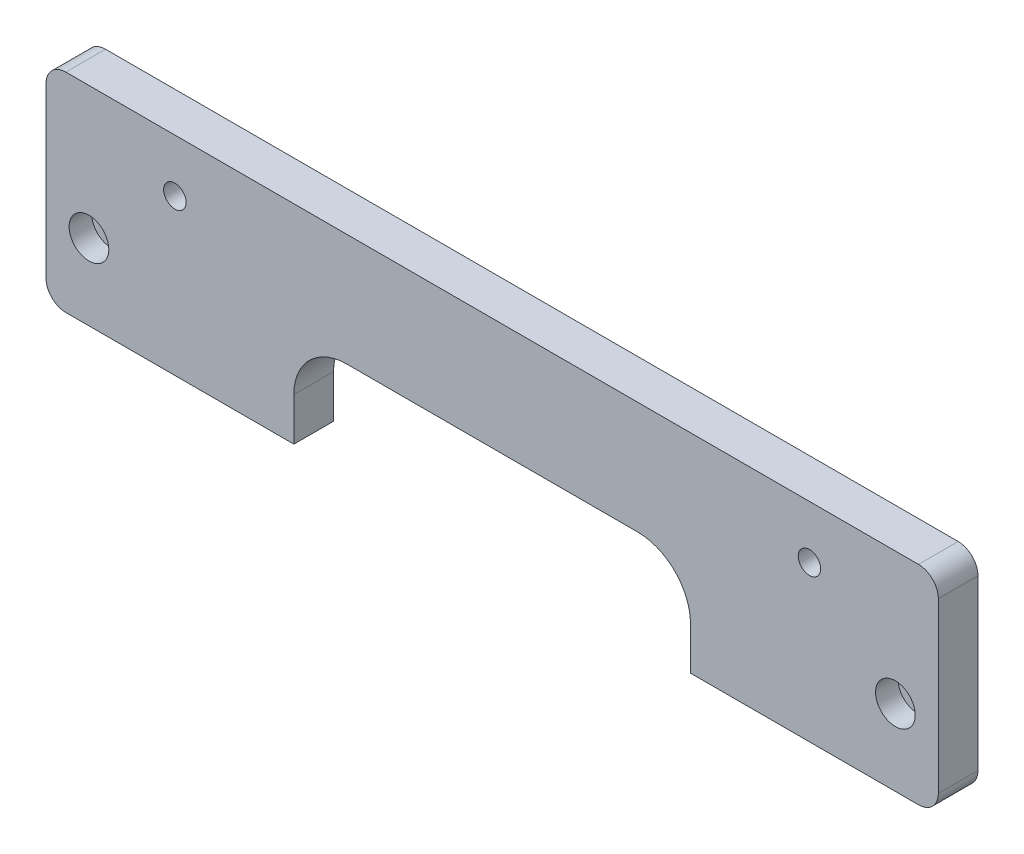
ISO-10303-21;
HEADER;
FILE_DESCRIPTION(('STEP AP214'),'2;1');
FILE_NAME('part.step','',(''),(''),'','','');
FILE_SCHEMA(('AUTOMOTIVE_DESIGN { 1 0 10303 214 1 1 1 1 }'));
ENDSEC;
DATA;
#1=APPLICATION_CONTEXT('core data for automotive mechanical design processes');
#2=APPLICATION_PROTOCOL_DEFINITION('international standard','automotive_design',2000,#1);
#3=PRODUCT_CONTEXT('',#1,'mechanical');
#4=PRODUCT('Part','Part','',(#3));
#5=PRODUCT_RELATED_PRODUCT_CATEGORY('part','',(#4));
#6=PRODUCT_DEFINITION_FORMATION('','',#4);
#7=PRODUCT_DEFINITION_CONTEXT('part definition',#1,'design');
#8=PRODUCT_DEFINITION('design','',#6,#7);
#9=PRODUCT_DEFINITION_SHAPE('','',#8);
#10=(LENGTH_UNIT() NAMED_UNIT(*) SI_UNIT(.MILLI.,.METRE.));
#11=(NAMED_UNIT(*) PLANE_ANGLE_UNIT() SI_UNIT($,.RADIAN.));
#12=(NAMED_UNIT(*) SI_UNIT($,.STERADIAN.) SOLID_ANGLE_UNIT());
#13=UNCERTAINTY_MEASURE_WITH_UNIT(LENGTH_MEASURE(1.E-05),#10,'distance_accuracy_value','');
#14=(GEOMETRIC_REPRESENTATION_CONTEXT(3) GLOBAL_UNCERTAINTY_ASSIGNED_CONTEXT((#13)) GLOBAL_UNIT_ASSIGNED_CONTEXT((#10,
#11,#12)) REPRESENTATION_CONTEXT('',''));
#15=CARTESIAN_POINT('',(0.,0.,0.));
#16=DIRECTION('',(0.,0.,1.));
#17=DIRECTION('',(1.,0.,0.));
#18=AXIS2_PLACEMENT_3D('',#15,#16,#17);
#19=CARTESIAN_POINT('',(0.,0.,6.));
#20=DIRECTION('',(1.,0.,0.));
#21=DIRECTION('',(0.,0.,-1.));
#22=AXIS2_PLACEMENT_3D('',#19,#20,#21);
#23=PLANE('',#22);
#24=DIRECTION('',(0.,-1.,0.));
#25=VECTOR('',#24,1.);
#26=CARTESIAN_POINT('',(0.,0.,0.));
#27=LINE('',#26,#25);
#28=CARTESIAN_POINT('',(0.,28.5,0.));
#29=VERTEX_POINT('',#28);
#30=CARTESIAN_POINT('',(0.,3.,0.));
#31=VERTEX_POINT('',#30);
#32=EDGE_CURVE('E163',#29,#31,#27,.T.);
#33=ORIENTED_EDGE('',*,*,#32,.T.);
#34=DIRECTION('',(0.,0.,-1.));
#35=VECTOR('',#34,1.);
#36=CARTESIAN_POINT('',(0.,3.,6.));
#37=LINE('',#36,#35);
#38=CARTESIAN_POINT('',(0.,3.,6.));
#39=VERTEX_POINT('',#38);
#40=EDGE_CURVE('E11',#31,#39,#37,.F.);
#41=ORIENTED_EDGE('',*,*,#40,.T.);
#42=DIRECTION('',(0.,-1.,0.));
#43=VECTOR('',#42,1.);
#44=CARTESIAN_POINT('',(0.,0.,6.));
#45=LINE('',#44,#43);
#46=CARTESIAN_POINT('',(0.,28.5,6.));
#47=VERTEX_POINT('',#46);
#48=EDGE_CURVE('E130',#47,#39,#45,.T.);
#49=ORIENTED_EDGE('',*,*,#48,.F.);
#50=DIRECTION('',(0.,0.,-1.));
#51=VECTOR('',#50,1.);
#52=CARTESIAN_POINT('',(0.,28.5,6.));
#53=LINE('',#52,#51);
#54=EDGE_CURVE('E25',#47,#29,#53,.T.);
#55=ORIENTED_EDGE('',*,*,#54,.T.);
#56=EDGE_LOOP('',(#33,#41,#49,#55));
#57=FACE_BOUND('',#56,.T.);
#58=ADVANCED_FACE('F17',(#57),#23,.F.);
#59=CARTESIAN_POINT('',(0.,0.,6.));
#60=DIRECTION('',(0.,1.,0.));
#61=DIRECTION('',(0.,0.,1.));
#62=AXIS2_PLACEMENT_3D('',#59,#60,#61);
#63=PLANE('',#62);
#64=DIRECTION('',(1.,0.,0.));
#65=VECTOR('',#64,1.);
#66=CARTESIAN_POINT('',(0.,0.,6.));
#67=LINE('',#66,#65);
#68=CARTESIAN_POINT('',(3.,0.,6.));
#69=VERTEX_POINT('',#68);
#70=CARTESIAN_POINT('',(37.5,0.,6.));
#71=VERTEX_POINT('',#70);
#72=EDGE_CURVE('E117',#69,#71,#67,.T.);
#73=ORIENTED_EDGE('',*,*,#72,.F.);
#74=DIRECTION('',(0.,0.,-1.));
#75=VECTOR('',#74,1.);
#76=CARTESIAN_POINT('',(3.,0.,6.));
#77=LINE('',#76,#75);
#78=CARTESIAN_POINT('',(3.,0.,0.));
#79=VERTEX_POINT('',#78);
#80=EDGE_CURVE('E222',#69,#79,#77,.T.);
#81=ORIENTED_EDGE('',*,*,#80,.T.);
#82=DIRECTION('',(1.,0.,0.));
#83=VECTOR('',#82,1.);
#84=CARTESIAN_POINT('',(0.,0.,0.));
#85=LINE('',#84,#83);
#86=CARTESIAN_POINT('',(37.5,0.,0.));
#87=VERTEX_POINT('',#86);
#88=EDGE_CURVE('E136',#79,#87,#85,.T.);
#89=ORIENTED_EDGE('',*,*,#88,.T.);
#90=DIRECTION('',(0.,0.,-1.));
#91=VECTOR('',#90,1.);
#92=CARTESIAN_POINT('',(37.5,0.,6.));
#93=LINE('',#92,#91);
#94=EDGE_CURVE('E133',#71,#87,#93,.T.);
#95=ORIENTED_EDGE('',*,*,#94,.F.);
#96=EDGE_LOOP('',(#73,#81,#89,#95));
#97=FACE_BOUND('',#96,.T.);
#98=ADVANCED_FACE('F134',(#97),#63,.F.);
#99=CARTESIAN_POINT('',(37.5,0.,6.));
#100=DIRECTION('',(-1.,0.,0.));
#101=DIRECTION('',(0.,0.,1.));
#102=AXIS2_PLACEMENT_3D('',#99,#100,#101);
#103=PLANE('',#102);
#104=DIRECTION('',(0.,1.,0.));
#105=VECTOR('',#104,1.);
#106=CARTESIAN_POINT('',(37.5,0.,0.));
#107=LINE('',#106,#105);
#108=CARTESIAN_POINT('',(37.5,6.5,0.));
#109=VERTEX_POINT('',#108);
#110=EDGE_CURVE('E168',#87,#109,#107,.T.);
#111=ORIENTED_EDGE('',*,*,#110,.T.);
#112=DIRECTION('',(0.,0.,-1.));
#113=VECTOR('',#112,1.);
#114=CARTESIAN_POINT('',(37.5,6.5,6.));
#115=LINE('',#114,#113);
#116=CARTESIAN_POINT('',(37.5,6.5,6.));
#117=VERTEX_POINT('',#116);
#118=EDGE_CURVE('E140',#117,#109,#115,.T.);
#119=ORIENTED_EDGE('',*,*,#118,.F.);
#120=DIRECTION('',(0.,1.,0.));
#121=VECTOR('',#120,1.);
#122=CARTESIAN_POINT('',(37.5,0.,6.));
#123=LINE('',#122,#121);
#124=EDGE_CURVE('E122',#71,#117,#123,.T.);
#125=ORIENTED_EDGE('',*,*,#124,.F.);
#126=ORIENTED_EDGE('',*,*,#94,.T.);
#127=EDGE_LOOP('',(#111,#119,#125,#126));
#128=FACE_BOUND('',#127,.T.);
#129=ADVANCED_FACE('F142',(#128),#103,.F.);
#130=CARTESIAN_POINT('',(45.5,6.5,6.));
#131=DIRECTION('',(0.,0.,-1.));
#132=DIRECTION('',(-1.,0.,0.));
#133=AXIS2_PLACEMENT_3D('',#130,#131,#132);
#134=CYLINDRICAL_SURFACE('',#133,8.);
#135=CARTESIAN_POINT('',(45.5,6.5,0.));
#136=DIRECTION('',(0.,0.,-1.));
#137=DIRECTION('',(-1.,0.,0.));
#138=AXIS2_PLACEMENT_3D('',#135,#136,#137);
#139=CIRCLE('',#138,8.);
#140=CARTESIAN_POINT('',(45.5,14.5,0.));
#141=VERTEX_POINT('',#140);
#142=EDGE_CURVE('E170',#109,#141,#139,.T.);
#143=ORIENTED_EDGE('',*,*,#142,.T.);
#144=DIRECTION('',(0.,0.,-1.));
#145=VECTOR('',#144,1.);
#146=CARTESIAN_POINT('',(45.5,14.5,6.));
#147=LINE('',#146,#145);
#148=CARTESIAN_POINT('',(45.5,14.5,6.));
#149=VERTEX_POINT('',#148);
#150=EDGE_CURVE('E194',#149,#141,#147,.T.);
#151=ORIENTED_EDGE('',*,*,#150,.F.);
#152=CARTESIAN_POINT('',(45.5,6.5,6.));
#153=DIRECTION('',(0.,0.,-1.));
#154=DIRECTION('',(-1.,0.,0.));
#155=AXIS2_PLACEMENT_3D('',#152,#153,#154);
#156=CIRCLE('',#155,8.);
#157=EDGE_CURVE('E145',#117,#149,#156,.T.);
#158=ORIENTED_EDGE('',*,*,#157,.F.);
#159=ORIENTED_EDGE('',*,*,#118,.T.);
#160=EDGE_LOOP('',(#143,#151,#158,#159));
#161=FACE_BOUND('',#160,.T.);
#162=ADVANCED_FACE('F536',(#161),#134,.F.);
#163=CARTESIAN_POINT('',(45.5,14.5,6.));
#164=DIRECTION('',(0.,1.,0.));
#165=DIRECTION('',(-1.,0.,0.));
#166=AXIS2_PLACEMENT_3D('',#163,#164,#165);
#167=PLANE('',#166);
#168=DIRECTION('',(1.,0.,0.));
#169=VECTOR('',#168,1.);
#170=CARTESIAN_POINT('',(45.5,14.5,0.));
#171=LINE('',#170,#169);
#172=CARTESIAN_POINT('',(89.5,14.5,0.));
#173=VERTEX_POINT('',#172);
#174=EDGE_CURVE('E172',#141,#173,#171,.T.);
#175=ORIENTED_EDGE('',*,*,#174,.T.);
#176=DIRECTION('',(0.,0.,-1.));
#177=VECTOR('',#176,1.);
#178=CARTESIAN_POINT('',(89.5,14.5,6.));
#179=LINE('',#178,#177);
#180=CARTESIAN_POINT('',(89.5,14.5,6.));
#181=VERTEX_POINT('',#180);
#182=EDGE_CURVE('E191',#181,#173,#179,.T.);
#183=ORIENTED_EDGE('',*,*,#182,.F.);
#184=DIRECTION('',(1.,0.,0.));
#185=VECTOR('',#184,1.);
#186=CARTESIAN_POINT('',(45.5,14.5,6.));
#187=LINE('',#186,#185);
#188=EDGE_CURVE('E147',#149,#181,#187,.T.);
#189=ORIENTED_EDGE('',*,*,#188,.F.);
#190=ORIENTED_EDGE('',*,*,#150,.T.);
#191=EDGE_LOOP('',(#175,#183,#189,#190));
#192=FACE_BOUND('',#191,.T.);
#193=ADVANCED_FACE('F526',(#192),#167,.F.);
#194=CARTESIAN_POINT('',(89.5,6.5,6.));
#195=DIRECTION('',(0.,0.,-1.));
#196=DIRECTION('',(-1.,0.,0.));
#197=AXIS2_PLACEMENT_3D('',#194,#195,#196);
#198=CYLINDRICAL_SURFACE('',#197,8.);
#199=CARTESIAN_POINT('',(89.5,6.5,0.));
#200=DIRECTION('',(0.,0.,-1.));
#201=DIRECTION('',(-1.,0.,0.));
#202=AXIS2_PLACEMENT_3D('',#199,#200,#201);
#203=CIRCLE('',#202,8.);
#204=CARTESIAN_POINT('',(97.5,6.5,0.));
#205=VERTEX_POINT('',#204);
#206=EDGE_CURVE('E174',#173,#205,#203,.T.);
#207=ORIENTED_EDGE('',*,*,#206,.T.);
#208=DIRECTION('',(0.,0.,-1.));
#209=VECTOR('',#208,1.);
#210=CARTESIAN_POINT('',(97.5,6.5,6.));
#211=LINE('',#210,#209);
#212=CARTESIAN_POINT('',(97.5,6.5,6.));
#213=VERTEX_POINT('',#212);
#214=EDGE_CURVE('E188',#213,#205,#211,.T.);
#215=ORIENTED_EDGE('',*,*,#214,.F.);
#216=CARTESIAN_POINT('',(89.5,6.5,6.));
#217=DIRECTION('',(0.,0.,-1.));
#218=DIRECTION('',(-1.,0.,0.));
#219=AXIS2_PLACEMENT_3D('',#216,#217,#218);
#220=CIRCLE('',#219,8.);
#221=EDGE_CURVE('E152',#181,#213,#220,.T.);
#222=ORIENTED_EDGE('',*,*,#221,.F.);
#223=ORIENTED_EDGE('',*,*,#182,.T.);
#224=EDGE_LOOP('',(#207,#215,#222,#223));
#225=FACE_BOUND('',#224,.T.);
#226=ADVANCED_FACE('F516',(#225),#198,.F.);
#227=CARTESIAN_POINT('',(97.5,6.5,6.));
#228=DIRECTION('',(1.,0.,0.));
#229=DIRECTION('',(0.,0.,-1.));
#230=AXIS2_PLACEMENT_3D('',#227,#228,#229);
#231=PLANE('',#230);
#232=DIRECTION('',(0.,-1.,0.));
#233=VECTOR('',#232,1.);
#234=CARTESIAN_POINT('',(97.5,6.5,0.));
#235=LINE('',#234,#233);
#236=CARTESIAN_POINT('',(97.5,0.,0.));
#237=VERTEX_POINT('',#236);
#238=EDGE_CURVE('E176',#205,#237,#235,.T.);
#239=ORIENTED_EDGE('',*,*,#238,.T.);
#240=DIRECTION('',(0.,0.,-1.));
#241=VECTOR('',#240,1.);
#242=CARTESIAN_POINT('',(97.5,0.,6.));
#243=LINE('',#242,#241);
#244=CARTESIAN_POINT('',(97.5,0.,6.));
#245=VERTEX_POINT('',#244);
#246=EDGE_CURVE('E162',#245,#237,#243,.T.);
#247=ORIENTED_EDGE('',*,*,#246,.F.);
#248=DIRECTION('',(0.,-1.,0.));
#249=VECTOR('',#248,1.);
#250=CARTESIAN_POINT('',(97.5,6.5,6.));
#251=LINE('',#250,#249);
#252=EDGE_CURVE('E154',#213,#245,#251,.T.);
#253=ORIENTED_EDGE('',*,*,#252,.F.);
#254=ORIENTED_EDGE('',*,*,#214,.T.);
#255=EDGE_LOOP('',(#239,#247,#253,#254));
#256=FACE_BOUND('',#255,.T.);
#257=ADVANCED_FACE('F507',(#256),#231,.F.);
#258=CARTESIAN_POINT('',(97.5,0.,6.));
#259=DIRECTION('',(0.,1.,0.));
#260=DIRECTION('',(-1.,0.,0.));
#261=AXIS2_PLACEMENT_3D('',#258,#259,#260);
#262=PLANE('',#261);
#263=DIRECTION('',(1.,0.,0.));
#264=VECTOR('',#263,1.);
#265=CARTESIAN_POINT('',(97.5,0.,0.));
#266=LINE('',#265,#264);
#267=CARTESIAN_POINT('',(132.,0.,0.));
#268=VERTEX_POINT('',#267);
#269=EDGE_CURVE('E178',#237,#268,#266,.T.);
#270=ORIENTED_EDGE('',*,*,#269,.T.);
#271=DIRECTION('',(0.,0.,-1.));
#272=VECTOR('',#271,1.);
#273=CARTESIAN_POINT('',(132.,0.,6.));
#274=LINE('',#273,#272);
#275=CARTESIAN_POINT('',(132.,0.,6.));
#276=VERTEX_POINT('',#275);
#277=EDGE_CURVE('E210',#268,#276,#274,.F.);
#278=ORIENTED_EDGE('',*,*,#277,.T.);
#279=DIRECTION('',(1.,0.,0.));
#280=VECTOR('',#279,1.);
#281=CARTESIAN_POINT('',(97.5,0.,6.));
#282=LINE('',#281,#280);
#283=EDGE_CURVE('E156',#245,#276,#282,.T.);
#284=ORIENTED_EDGE('',*,*,#283,.F.);
#285=ORIENTED_EDGE('',*,*,#246,.T.);
#286=EDGE_LOOP('',(#270,#278,#284,#285));
#287=FACE_BOUND('',#286,.T.);
#288=ADVANCED_FACE('F498',(#287),#262,.F.);
#289=CARTESIAN_POINT('',(135.,0.,6.));
#290=DIRECTION('',(-1.,0.,0.));
#291=DIRECTION('',(0.,0.,1.));
#292=AXIS2_PLACEMENT_3D('',#289,#290,#291);
#293=PLANE('',#292);
#294=DIRECTION('',(0.,1.,0.));
#295=VECTOR('',#294,1.);
#296=CARTESIAN_POINT('',(135.,0.,6.));
#297=LINE('',#296,#295);
#298=CARTESIAN_POINT('',(135.,3.,6.));
#299=VERTEX_POINT('',#298);
#300=CARTESIAN_POINT('',(135.,28.5,6.));
#301=VERTEX_POINT('',#300);
#302=EDGE_CURVE('E158',#299,#301,#297,.T.);
#303=ORIENTED_EDGE('',*,*,#302,.F.);
#304=DIRECTION('',(0.,0.,-1.));
#305=VECTOR('',#304,1.);
#306=CARTESIAN_POINT('',(135.,3.,6.));
#307=LINE('',#306,#305);
#308=CARTESIAN_POINT('',(135.,3.,0.));
#309=VERTEX_POINT('',#308);
#310=EDGE_CURVE('E199',#299,#309,#307,.T.);
#311=ORIENTED_EDGE('',*,*,#310,.T.);
#312=DIRECTION('',(0.,1.,0.));
#313=VECTOR('',#312,1.);
#314=CARTESIAN_POINT('',(135.,0.,0.));
#315=LINE('',#314,#313);
#316=CARTESIAN_POINT('',(135.,28.5,0.));
#317=VERTEX_POINT('',#316);
#318=EDGE_CURVE('E181',#309,#317,#315,.T.);
#319=ORIENTED_EDGE('',*,*,#318,.T.);
#320=DIRECTION('',(0.,0.,-1.));
#321=VECTOR('',#320,1.);
#322=CARTESIAN_POINT('',(135.,28.5,6.));
#323=LINE('',#322,#321);
#324=EDGE_CURVE('E139',#317,#301,#323,.F.);
#325=ORIENTED_EDGE('',*,*,#324,.T.);
#326=EDGE_LOOP('',(#303,#311,#319,#325));
#327=FACE_BOUND('',#326,.T.);
#328=ADVANCED_FACE('F489',(#327),#293,.F.);
#329=CARTESIAN_POINT('',(0.,31.5,6.));
#330=DIRECTION('',(0.,-1.,0.));
#331=DIRECTION('',(1.,0.,0.));
#332=AXIS2_PLACEMENT_3D('',#329,#330,#331);
#333=PLANE('',#332);
#334=DIRECTION('',(-1.,0.,0.));
#335=VECTOR('',#334,1.);
#336=CARTESIAN_POINT('',(0.,31.5,6.));
#337=LINE('',#336,#335);
#338=CARTESIAN_POINT('',(132.,31.5,6.));
#339=VERTEX_POINT('',#338);
#340=CARTESIAN_POINT('',(3.,31.5,6.));
#341=VERTEX_POINT('',#340);
#342=EDGE_CURVE('E160',#339,#341,#337,.T.);
#343=ORIENTED_EDGE('',*,*,#342,.F.);
#344=DIRECTION('',(0.,0.,-1.));
#345=VECTOR('',#344,1.);
#346=CARTESIAN_POINT('',(132.,31.5,6.));
#347=LINE('',#346,#345);
#348=CARTESIAN_POINT('',(132.,31.5,0.));
#349=VERTEX_POINT('',#348);
#350=EDGE_CURVE('E219',#339,#349,#347,.T.);
#351=ORIENTED_EDGE('',*,*,#350,.T.);
#352=DIRECTION('',(-1.,0.,0.));
#353=VECTOR('',#352,1.);
#354=CARTESIAN_POINT('',(0.,31.5,0.));
#355=LINE('',#354,#353);
#356=CARTESIAN_POINT('',(3.,31.5,0.));
#357=VERTEX_POINT('',#356);
#358=EDGE_CURVE('E184',#349,#357,#355,.T.);
#359=ORIENTED_EDGE('',*,*,#358,.T.);
#360=DIRECTION('',(0.,0.,-1.));
#361=VECTOR('',#360,1.);
#362=CARTESIAN_POINT('',(3.,31.5,6.));
#363=LINE('',#362,#361);
#364=EDGE_CURVE('E32',#357,#341,#363,.F.);
#365=ORIENTED_EDGE('',*,*,#364,.T.);
#366=EDGE_LOOP('',(#343,#351,#359,#365));
#367=FACE_BOUND('',#366,.T.);
#368=ADVANCED_FACE('F480',(#367),#333,.F.);
#369=CARTESIAN_POINT('',(89.5,6.5,6.));
#370=DIRECTION('',(0.,0.,-1.));
#371=DIRECTION('',(-1.,0.,0.));
#372=AXIS2_PLACEMENT_3D('',#369,#370,#371);
#373=PLANE('',#372);
#374=CARTESIAN_POINT('',(115.5,23.5,6.));
#375=DIRECTION('',(0.,0.,-1.));
#376=DIRECTION('',(-1.,0.,0.));
#377=AXIS2_PLACEMENT_3D('',#374,#375,#376);
#378=CIRCLE('',#377,1.7);
#379=CARTESIAN_POINT('',(113.8,23.5,6.));
#380=VERTEX_POINT('',#379);
#381=EDGE_CURVE('E273',#380,#380,#378,.T.);
#382=ORIENTED_EDGE('',*,*,#381,.T.);
#383=EDGE_LOOP('',(#382));
#384=FACE_BOUND('',#383,.T.);
#385=CARTESIAN_POINT('',(19.5,23.5,6.));
#386=DIRECTION('',(0.,0.,-1.));
#387=DIRECTION('',(-1.,0.,0.));
#388=AXIS2_PLACEMENT_3D('',#385,#386,#387);
#389=CIRCLE('',#388,1.7);
#390=CARTESIAN_POINT('',(17.8,23.5,6.));
#391=VERTEX_POINT('',#390);
#392=EDGE_CURVE('E261',#391,#391,#389,.T.);
#393=ORIENTED_EDGE('',*,*,#392,.T.);
#394=EDGE_LOOP('',(#393));
#395=FACE_BOUND('',#394,.T.);
#396=CARTESIAN_POINT('',(6.5,11.5,6.));
#397=DIRECTION('',(0.,0.,1.));
#398=DIRECTION('',(1.,0.,0.));
#399=AXIS2_PLACEMENT_3D('',#396,#397,#398);
#400=CIRCLE('',#399,3.);
#401=CARTESIAN_POINT('',(9.5,11.5,6.));
#402=VERTEX_POINT('',#401);
#403=EDGE_CURVE('E258',#402,#402,#400,.T.);
#404=ORIENTED_EDGE('',*,*,#403,.F.);
#405=EDGE_LOOP('',(#404));
#406=FACE_BOUND('',#405,.T.);
#407=CARTESIAN_POINT('',(128.5,11.5,6.));
#408=DIRECTION('',(0.,0.,1.));
#409=DIRECTION('',(1.,0.,0.));
#410=AXIS2_PLACEMENT_3D('',#407,#408,#409);
#411=CIRCLE('',#410,3.);
#412=CARTESIAN_POINT('',(131.5,11.5,6.));
#413=VERTEX_POINT('',#412);
#414=EDGE_CURVE('E246',#413,#413,#411,.T.);
#415=ORIENTED_EDGE('',*,*,#414,.F.);
#416=EDGE_LOOP('',(#415));
#417=FACE_BOUND('',#416,.T.);
#418=ORIENTED_EDGE('',*,*,#283,.T.);
#419=CARTESIAN_POINT('',(132.,3.,6.));
#420=DIRECTION('',(0.,0.,-1.));
#421=DIRECTION('',(-1.,0.,0.));
#422=AXIS2_PLACEMENT_3D('',#419,#420,#421);
#423=CIRCLE('',#422,3.);
#424=EDGE_CURVE('E216',#276,#299,#423,.F.);
#425=ORIENTED_EDGE('',*,*,#424,.T.);
#426=ORIENTED_EDGE('',*,*,#302,.T.);
#427=CARTESIAN_POINT('',(132.,28.5,6.));
#428=DIRECTION('',(0.,0.,-1.));
#429=DIRECTION('',(-1.,0.,0.));
#430=AXIS2_PLACEMENT_3D('',#427,#428,#429);
#431=CIRCLE('',#430,3.);
#432=EDGE_CURVE('E39',#301,#339,#431,.F.);
#433=ORIENTED_EDGE('',*,*,#432,.T.);
#434=ORIENTED_EDGE('',*,*,#342,.T.);
#435=CARTESIAN_POINT('',(3.,28.5,6.));
#436=DIRECTION('',(0.,0.,-1.));
#437=DIRECTION('',(-1.,0.,0.));
#438=AXIS2_PLACEMENT_3D('',#435,#436,#437);
#439=CIRCLE('',#438,3.);
#440=EDGE_CURVE('E212',#341,#47,#439,.F.);
#441=ORIENTED_EDGE('',*,*,#440,.T.);
#442=ORIENTED_EDGE('',*,*,#48,.T.);
#443=CARTESIAN_POINT('',(3.,3.,6.));
#444=DIRECTION('',(0.,0.,-1.));
#445=DIRECTION('',(-1.,0.,0.));
#446=AXIS2_PLACEMENT_3D('',#443,#444,#445);
#447=CIRCLE('',#446,3.);
#448=EDGE_CURVE('E126',#39,#69,#447,.F.);
#449=ORIENTED_EDGE('',*,*,#448,.T.);
#450=ORIENTED_EDGE('',*,*,#72,.T.);
#451=ORIENTED_EDGE('',*,*,#124,.T.);
#452=ORIENTED_EDGE('',*,*,#157,.T.);
#453=ORIENTED_EDGE('',*,*,#188,.T.);
#454=ORIENTED_EDGE('',*,*,#221,.T.);
#455=ORIENTED_EDGE('',*,*,#252,.T.);
#456=EDGE_LOOP('',(#418,#425,#426,#433,#434,#441,#442,#449,#450,#451,#452,#453,#454,#455));
#457=FACE_BOUND('',#456,.T.);
#458=ADVANCED_FACE('F120',(#384,#395,#406,#417,#457),#373,.F.);
#459=CARTESIAN_POINT('',(89.5,6.5,0.));
#460=DIRECTION('',(0.,0.,-1.));
#461=DIRECTION('',(-1.,0.,0.));
#462=AXIS2_PLACEMENT_3D('',#459,#460,#461);
#463=PLANE('',#462);
#464=CARTESIAN_POINT('',(115.5,23.5,0.));
#465=DIRECTION('',(0.,0.,-1.));
#466=DIRECTION('',(-1.,0.,0.));
#467=AXIS2_PLACEMENT_3D('',#464,#465,#466);
#468=CIRCLE('',#467,3.);
#469=CARTESIAN_POINT('',(112.5,23.5,0.));
#470=VERTEX_POINT('',#469);
#471=EDGE_CURVE('E282',#470,#470,#468,.T.);
#472=ORIENTED_EDGE('',*,*,#471,.F.);
#473=EDGE_LOOP('',(#472));
#474=FACE_BOUND('',#473,.T.);
#475=CARTESIAN_POINT('',(19.5,23.5,0.));
#476=DIRECTION('',(0.,0.,-1.));
#477=DIRECTION('',(-1.,0.,0.));
#478=AXIS2_PLACEMENT_3D('',#475,#476,#477);
#479=CIRCLE('',#478,3.);
#480=CARTESIAN_POINT('',(16.5,23.5,0.));
#481=VERTEX_POINT('',#480);
#482=EDGE_CURVE('E270',#481,#481,#479,.T.);
#483=ORIENTED_EDGE('',*,*,#482,.F.);
#484=EDGE_LOOP('',(#483));
#485=FACE_BOUND('',#484,.T.);
#486=CARTESIAN_POINT('',(6.5,11.5,0.));
#487=DIRECTION('',(0.,0.,-1.));
#488=DIRECTION('',(-1.,0.,0.));
#489=AXIS2_PLACEMENT_3D('',#486,#487,#488);
#490=CIRCLE('',#489,1.7);
#491=CARTESIAN_POINT('',(4.8,11.5,0.));
#492=VERTEX_POINT('',#491);
#493=EDGE_CURVE('E249',#492,#492,#490,.T.);
#494=ORIENTED_EDGE('',*,*,#493,.F.);
#495=EDGE_LOOP('',(#494));
#496=FACE_BOUND('',#495,.T.);
#497=CARTESIAN_POINT('',(128.5,11.5,0.));
#498=DIRECTION('',(0.,0.,-1.));
#499=DIRECTION('',(-1.,0.,0.));
#500=AXIS2_PLACEMENT_3D('',#497,#498,#499);
#501=CIRCLE('',#500,1.7);
#502=CARTESIAN_POINT('',(126.8,11.5,0.));
#503=VERTEX_POINT('',#502);
#504=EDGE_CURVE('E166',#503,#503,#501,.T.);
#505=ORIENTED_EDGE('',*,*,#504,.F.);
#506=EDGE_LOOP('',(#505));
#507=FACE_BOUND('',#506,.T.);
#508=ORIENTED_EDGE('',*,*,#318,.F.);
#509=CARTESIAN_POINT('',(132.,3.,0.));
#510=DIRECTION('',(0.,0.,-1.));
#511=DIRECTION('',(-1.,0.,0.));
#512=AXIS2_PLACEMENT_3D('',#509,#510,#511);
#513=CIRCLE('',#512,3.);
#514=EDGE_CURVE('E208',#309,#268,#513,.T.);
#515=ORIENTED_EDGE('',*,*,#514,.T.);
#516=ORIENTED_EDGE('',*,*,#269,.F.);
#517=ORIENTED_EDGE('',*,*,#238,.F.);
#518=ORIENTED_EDGE('',*,*,#206,.F.);
#519=ORIENTED_EDGE('',*,*,#174,.F.);
#520=ORIENTED_EDGE('',*,*,#142,.F.);
#521=ORIENTED_EDGE('',*,*,#110,.F.);
#522=ORIENTED_EDGE('',*,*,#88,.F.);
#523=CARTESIAN_POINT('',(3.,3.,0.));
#524=DIRECTION('',(0.,0.,-1.));
#525=DIRECTION('',(-1.,0.,0.));
#526=AXIS2_PLACEMENT_3D('',#523,#524,#525);
#527=CIRCLE('',#526,3.);
#528=EDGE_CURVE('E204',#79,#31,#527,.T.);
#529=ORIENTED_EDGE('',*,*,#528,.T.);
#530=ORIENTED_EDGE('',*,*,#32,.F.);
#531=CARTESIAN_POINT('',(3.,28.5,0.));
#532=DIRECTION('',(0.,0.,-1.));
#533=DIRECTION('',(-1.,0.,0.));
#534=AXIS2_PLACEMENT_3D('',#531,#532,#533);
#535=CIRCLE('',#534,3.);
#536=EDGE_CURVE('E202',#29,#357,#535,.T.);
#537=ORIENTED_EDGE('',*,*,#536,.T.);
#538=ORIENTED_EDGE('',*,*,#358,.F.);
#539=CARTESIAN_POINT('',(132.,28.5,0.));
#540=DIRECTION('',(0.,0.,-1.));
#541=DIRECTION('',(-1.,0.,0.));
#542=AXIS2_PLACEMENT_3D('',#539,#540,#541);
#543=CIRCLE('',#542,3.);
#544=EDGE_CURVE('E206',#349,#317,#543,.T.);
#545=ORIENTED_EDGE('',*,*,#544,.T.);
#546=EDGE_LOOP('',(#508,#515,#516,#517,#518,#519,#520,#521,#522,#529,#530,#537,#538,#545));
#547=FACE_BOUND('',#546,.T.);
#548=ADVANCED_FACE('F233',(#474,#485,#496,#507,#547),#463,.T.);
#549=CARTESIAN_POINT('',(128.5,11.5,6.));
#550=DIRECTION('',(0.,0.,1.));
#551=DIRECTION('',(1.,0.,0.));
#552=AXIS2_PLACEMENT_3D('',#549,#550,#551);
#553=CYLINDRICAL_SURFACE('',#552,1.7);
#554=CARTESIAN_POINT('',(128.5,11.5,2.6));
#555=DIRECTION('',(0.,0.,1.));
#556=DIRECTION('',(1.,0.,0.));
#557=AXIS2_PLACEMENT_3D('',#554,#555,#556);
#558=CIRCLE('',#557,1.7);
#559=CARTESIAN_POINT('',(130.2,11.5,2.6));
#560=VERTEX_POINT('',#559);
#561=EDGE_CURVE('E240',#560,#560,#558,.T.);
#562=ORIENTED_EDGE('',*,*,#561,.T.);
#563=EDGE_LOOP('',(#562));
#564=FACE_BOUND('',#563,.T.);
#565=ORIENTED_EDGE('',*,*,#504,.T.);
#566=EDGE_LOOP('',(#565));
#567=FACE_BOUND('',#566,.T.);
#568=ADVANCED_FACE('F290',(#564,#567),#553,.F.);
#569=CARTESIAN_POINT('',(130.2,11.5,2.6));
#570=DIRECTION('',(0.,0.,-1.));
#571=DIRECTION('',(-1.,0.,0.));
#572=AXIS2_PLACEMENT_3D('',#569,#570,#571);
#573=PLANE('',#572);
#574=ORIENTED_EDGE('',*,*,#561,.F.);
#575=EDGE_LOOP('',(#574));
#576=FACE_BOUND('',#575,.T.);
#577=CARTESIAN_POINT('',(128.5,11.5,2.6));
#578=DIRECTION('',(0.,0.,1.));
#579=DIRECTION('',(1.,0.,0.));
#580=AXIS2_PLACEMENT_3D('',#577,#578,#579);
#581=CIRCLE('',#580,3.);
#582=CARTESIAN_POINT('',(131.5,11.5,2.6));
#583=VERTEX_POINT('',#582);
#584=EDGE_CURVE('E243',#583,#583,#581,.T.);
#585=ORIENTED_EDGE('',*,*,#584,.T.);
#586=EDGE_LOOP('',(#585));
#587=FACE_BOUND('',#586,.T.);
#588=ADVANCED_FACE('F299',(#576,#587),#573,.F.);
#589=CARTESIAN_POINT('',(128.5,11.5,6.));
#590=DIRECTION('',(0.,0.,1.));
#591=DIRECTION('',(1.,0.,0.));
#592=AXIS2_PLACEMENT_3D('',#589,#590,#591);
#593=CYLINDRICAL_SURFACE('',#592,3.);
#594=ORIENTED_EDGE('',*,*,#584,.F.);
#595=EDGE_LOOP('',(#594));
#596=FACE_BOUND('',#595,.T.);
#597=ORIENTED_EDGE('',*,*,#414,.T.);
#598=EDGE_LOOP('',(#597));
#599=FACE_BOUND('',#598,.T.);
#600=ADVANCED_FACE('F306',(#596,#599),#593,.F.);
#601=CARTESIAN_POINT('',(6.5,11.5,6.));
#602=DIRECTION('',(0.,0.,1.));
#603=DIRECTION('',(1.,0.,0.));
#604=AXIS2_PLACEMENT_3D('',#601,#602,#603);
#605=CYLINDRICAL_SURFACE('',#604,1.7);
#606=CARTESIAN_POINT('',(6.5,11.5,2.6));
#607=DIRECTION('',(0.,0.,1.));
#608=DIRECTION('',(1.,0.,0.));
#609=AXIS2_PLACEMENT_3D('',#606,#607,#608);
#610=CIRCLE('',#609,1.7);
#611=CARTESIAN_POINT('',(8.2,11.5,2.6));
#612=VERTEX_POINT('',#611);
#613=EDGE_CURVE('E252',#612,#612,#610,.T.);
#614=ORIENTED_EDGE('',*,*,#613,.T.);
#615=EDGE_LOOP('',(#614));
#616=FACE_BOUND('',#615,.T.);
#617=ORIENTED_EDGE('',*,*,#493,.T.);
#618=EDGE_LOOP('',(#617));
#619=FACE_BOUND('',#618,.T.);
#620=ADVANCED_FACE('F435',(#616,#619),#605,.F.);
#621=CARTESIAN_POINT('',(8.2,11.5,2.6));
#622=DIRECTION('',(0.,0.,-1.));
#623=DIRECTION('',(-1.,0.,0.));
#624=AXIS2_PLACEMENT_3D('',#621,#622,#623);
#625=PLANE('',#624);
#626=ORIENTED_EDGE('',*,*,#613,.F.);
#627=EDGE_LOOP('',(#626));
#628=FACE_BOUND('',#627,.T.);
#629=CARTESIAN_POINT('',(6.5,11.5,2.6));
#630=DIRECTION('',(0.,0.,1.));
#631=DIRECTION('',(1.,0.,0.));
#632=AXIS2_PLACEMENT_3D('',#629,#630,#631);
#633=CIRCLE('',#632,3.);
#634=CARTESIAN_POINT('',(9.5,11.5,2.6));
#635=VERTEX_POINT('',#634);
#636=EDGE_CURVE('E255',#635,#635,#633,.T.);
#637=ORIENTED_EDGE('',*,*,#636,.T.);
#638=EDGE_LOOP('',(#637));
#639=FACE_BOUND('',#638,.T.);
#640=ADVANCED_FACE('F425',(#628,#639),#625,.F.);
#641=CARTESIAN_POINT('',(6.5,11.5,6.));
#642=DIRECTION('',(0.,0.,1.));
#643=DIRECTION('',(1.,0.,0.));
#644=AXIS2_PLACEMENT_3D('',#641,#642,#643);
#645=CYLINDRICAL_SURFACE('',#644,3.);
#646=ORIENTED_EDGE('',*,*,#636,.F.);
#647=EDGE_LOOP('',(#646));
#648=FACE_BOUND('',#647,.T.);
#649=ORIENTED_EDGE('',*,*,#403,.T.);
#650=EDGE_LOOP('',(#649));
#651=FACE_BOUND('',#650,.T.);
#652=ADVANCED_FACE('F415',(#648,#651),#645,.F.);
#653=CARTESIAN_POINT('',(19.5,23.5,0.));
#654=DIRECTION('',(0.,0.,-1.));
#655=DIRECTION('',(-1.,0.,0.));
#656=AXIS2_PLACEMENT_3D('',#653,#654,#655);
#657=CYLINDRICAL_SURFACE('',#656,1.7);
#658=ORIENTED_EDGE('',*,*,#392,.F.);
#659=EDGE_LOOP('',(#658));
#660=FACE_BOUND('',#659,.T.);
#661=CARTESIAN_POINT('',(19.5,23.5,3.4));
#662=DIRECTION('',(0.,0.,-1.));
#663=DIRECTION('',(-1.,0.,0.));
#664=AXIS2_PLACEMENT_3D('',#661,#662,#663);
#665=CIRCLE('',#664,1.7);
#666=CARTESIAN_POINT('',(17.8,23.5,3.4));
#667=VERTEX_POINT('',#666);
#668=EDGE_CURVE('E264',#667,#667,#665,.T.);
#669=ORIENTED_EDGE('',*,*,#668,.T.);
#670=EDGE_LOOP('',(#669));
#671=FACE_BOUND('',#670,.T.);
#672=ADVANCED_FACE('F405',(#660,#671),#657,.F.);
#673=CARTESIAN_POINT('',(21.2,23.5,3.4));
#674=DIRECTION('',(0.,0.,1.));
#675=DIRECTION('',(1.,0.,0.));
#676=AXIS2_PLACEMENT_3D('',#673,#674,#675);
#677=PLANE('',#676);
#678=ORIENTED_EDGE('',*,*,#668,.F.);
#679=EDGE_LOOP('',(#678));
#680=FACE_BOUND('',#679,.T.);
#681=CARTESIAN_POINT('',(19.5,23.5,3.4));
#682=DIRECTION('',(0.,0.,-1.));
#683=DIRECTION('',(-1.,0.,0.));
#684=AXIS2_PLACEMENT_3D('',#681,#682,#683);
#685=CIRCLE('',#684,3.);
#686=CARTESIAN_POINT('',(16.5,23.5,3.4));
#687=VERTEX_POINT('',#686);
#688=EDGE_CURVE('E267',#687,#687,#685,.T.);
#689=ORIENTED_EDGE('',*,*,#688,.T.);
#690=EDGE_LOOP('',(#689));
#691=FACE_BOUND('',#690,.T.);
#692=ADVANCED_FACE('F395',(#680,#691),#677,.F.);
#693=CARTESIAN_POINT('',(19.5,23.5,0.));
#694=DIRECTION('',(0.,0.,-1.));
#695=DIRECTION('',(-1.,0.,0.));
#696=AXIS2_PLACEMENT_3D('',#693,#694,#695);
#697=CYLINDRICAL_SURFACE('',#696,3.);
#698=ORIENTED_EDGE('',*,*,#688,.F.);
#699=EDGE_LOOP('',(#698));
#700=FACE_BOUND('',#699,.T.);
#701=ORIENTED_EDGE('',*,*,#482,.T.);
#702=EDGE_LOOP('',(#701));
#703=FACE_BOUND('',#702,.T.);
#704=ADVANCED_FACE('F385',(#700,#703),#697,.F.);
#705=CARTESIAN_POINT('',(115.5,23.5,0.));
#706=DIRECTION('',(0.,0.,-1.));
#707=DIRECTION('',(-1.,0.,0.));
#708=AXIS2_PLACEMENT_3D('',#705,#706,#707);
#709=CYLINDRICAL_SURFACE('',#708,1.7);
#710=ORIENTED_EDGE('',*,*,#381,.F.);
#711=EDGE_LOOP('',(#710));
#712=FACE_BOUND('',#711,.T.);
#713=CARTESIAN_POINT('',(115.5,23.5,3.4));
#714=DIRECTION('',(0.,0.,-1.));
#715=DIRECTION('',(-1.,0.,0.));
#716=AXIS2_PLACEMENT_3D('',#713,#714,#715);
#717=CIRCLE('',#716,1.7);
#718=CARTESIAN_POINT('',(113.8,23.5,3.4));
#719=VERTEX_POINT('',#718);
#720=EDGE_CURVE('E276',#719,#719,#717,.T.);
#721=ORIENTED_EDGE('',*,*,#720,.T.);
#722=EDGE_LOOP('',(#721));
#723=FACE_BOUND('',#722,.T.);
#724=ADVANCED_FACE('F375',(#712,#723),#709,.F.);
#725=CARTESIAN_POINT('',(117.2,23.5,3.4));
#726=DIRECTION('',(0.,0.,1.));
#727=DIRECTION('',(1.,0.,0.));
#728=AXIS2_PLACEMENT_3D('',#725,#726,#727);
#729=PLANE('',#728);
#730=ORIENTED_EDGE('',*,*,#720,.F.);
#731=EDGE_LOOP('',(#730));
#732=FACE_BOUND('',#731,.T.);
#733=CARTESIAN_POINT('',(115.5,23.5,3.4));
#734=DIRECTION('',(0.,0.,-1.));
#735=DIRECTION('',(-1.,0.,0.));
#736=AXIS2_PLACEMENT_3D('',#733,#734,#735);
#737=CIRCLE('',#736,3.);
#738=CARTESIAN_POINT('',(112.5,23.5,3.4));
#739=VERTEX_POINT('',#738);
#740=EDGE_CURVE('E279',#739,#739,#737,.T.);
#741=ORIENTED_EDGE('',*,*,#740,.T.);
#742=EDGE_LOOP('',(#741));
#743=FACE_BOUND('',#742,.T.);
#744=ADVANCED_FACE('F364',(#732,#743),#729,.F.);
#745=CARTESIAN_POINT('',(115.5,23.5,0.));
#746=DIRECTION('',(0.,0.,-1.));
#747=DIRECTION('',(-1.,0.,0.));
#748=AXIS2_PLACEMENT_3D('',#745,#746,#747);
#749=CYLINDRICAL_SURFACE('',#748,3.);
#750=ORIENTED_EDGE('',*,*,#740,.F.);
#751=EDGE_LOOP('',(#750));
#752=FACE_BOUND('',#751,.T.);
#753=ORIENTED_EDGE('',*,*,#471,.T.);
#754=EDGE_LOOP('',(#753));
#755=FACE_BOUND('',#754,.T.);
#756=ADVANCED_FACE('F286',(#752,#755),#749,.F.);
#757=CARTESIAN_POINT('',(132.,3.,6.));
#758=DIRECTION('',(0.,0.,-1.));
#759=DIRECTION('',(-1.,0.,0.));
#760=AXIS2_PLACEMENT_3D('',#757,#758,#759);
#761=CYLINDRICAL_SURFACE('',#760,3.);
#762=ORIENTED_EDGE('',*,*,#424,.F.);
#763=ORIENTED_EDGE('',*,*,#277,.F.);
#764=ORIENTED_EDGE('',*,*,#514,.F.);
#765=ORIENTED_EDGE('',*,*,#310,.F.);
#766=EDGE_LOOP('',(#762,#763,#764,#765));
#767=FACE_BOUND('',#766,.T.);
#768=ADVANCED_FACE('F318',(#767),#761,.T.);
#769=CARTESIAN_POINT('',(132.,28.5,6.));
#770=DIRECTION('',(0.,0.,-1.));
#771=DIRECTION('',(-1.,0.,0.));
#772=AXIS2_PLACEMENT_3D('',#769,#770,#771);
#773=CYLINDRICAL_SURFACE('',#772,3.);
#774=ORIENTED_EDGE('',*,*,#432,.F.);
#775=ORIENTED_EDGE('',*,*,#324,.F.);
#776=ORIENTED_EDGE('',*,*,#544,.F.);
#777=ORIENTED_EDGE('',*,*,#350,.F.);
#778=EDGE_LOOP('',(#774,#775,#776,#777));
#779=FACE_BOUND('',#778,.T.);
#780=ADVANCED_FACE('F321',(#779),#773,.T.);
#781=CARTESIAN_POINT('',(3.,3.,6.));
#782=DIRECTION('',(0.,0.,-1.));
#783=DIRECTION('',(-1.,0.,0.));
#784=AXIS2_PLACEMENT_3D('',#781,#782,#783);
#785=CYLINDRICAL_SURFACE('',#784,3.);
#786=ORIENTED_EDGE('',*,*,#448,.F.);
#787=ORIENTED_EDGE('',*,*,#40,.F.);
#788=ORIENTED_EDGE('',*,*,#528,.F.);
#789=ORIENTED_EDGE('',*,*,#80,.F.);
#790=EDGE_LOOP('',(#786,#787,#788,#789));
#791=FACE_BOUND('',#790,.T.);
#792=ADVANCED_FACE('F236',(#791),#785,.T.);
#793=CARTESIAN_POINT('',(3.,28.5,6.));
#794=DIRECTION('',(0.,0.,-1.));
#795=DIRECTION('',(-1.,0.,0.));
#796=AXIS2_PLACEMENT_3D('',#793,#794,#795);
#797=CYLINDRICAL_SURFACE('',#796,3.);
#798=ORIENTED_EDGE('',*,*,#440,.F.);
#799=ORIENTED_EDGE('',*,*,#364,.F.);
#800=ORIENTED_EDGE('',*,*,#536,.F.);
#801=ORIENTED_EDGE('',*,*,#54,.F.);
#802=EDGE_LOOP('',(#798,#799,#800,#801));
#803=FACE_BOUND('',#802,.T.);
#804=ADVANCED_FACE('F19',(#803),#797,.T.);
#805=CLOSED_SHELL('',(#58,#98,#129,#162,#193,#226,#257,#288,#328,#368,#458,#548,#568,#588,#600,
#620,#640,#652,#672,#692,#704,#724,#744,#756,#768,#780,#792,#804));
#806=MANIFOLD_SOLID_BREP('B1',#805);
#807=ADVANCED_BREP_SHAPE_REPRESENTATION('',(#18,#806),#14);
#808=SHAPE_DEFINITION_REPRESENTATION(#9,#807);
ENDSEC;
END-ISO-10303-21;
